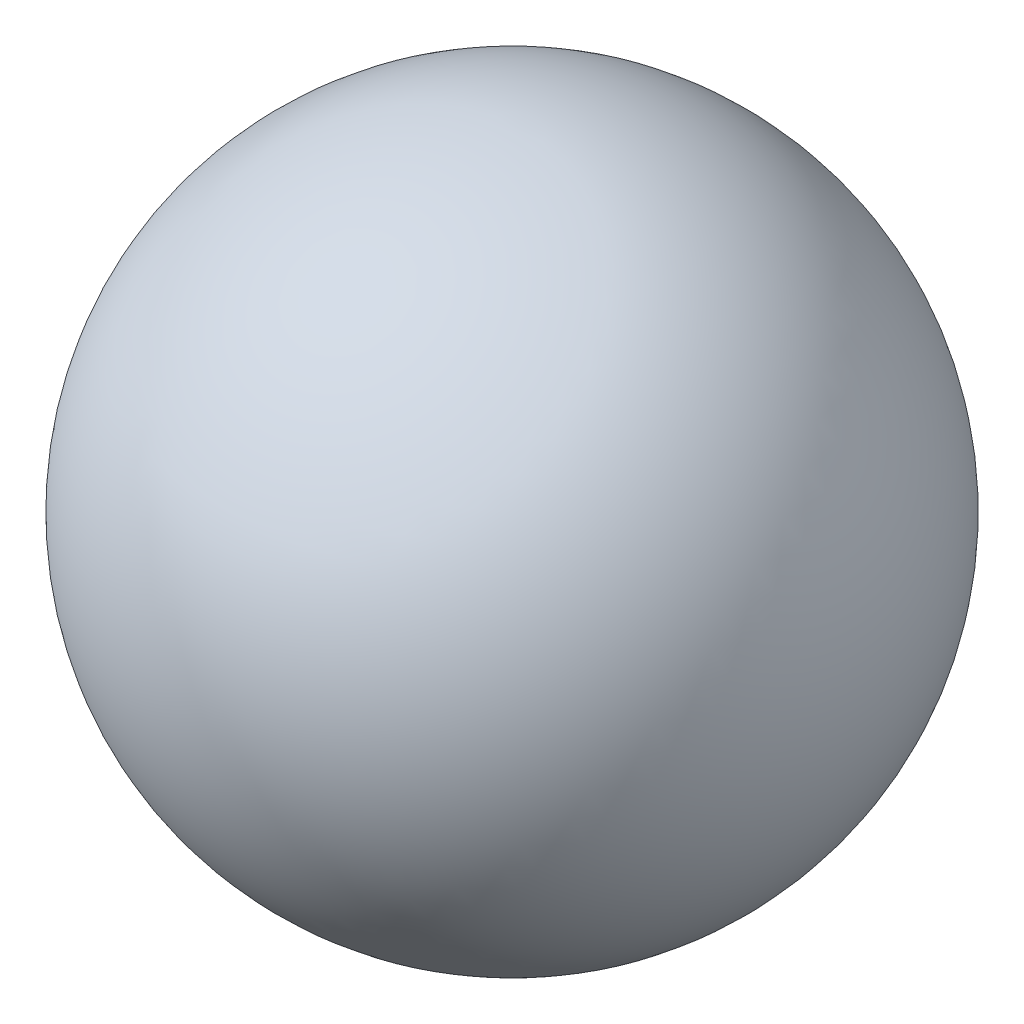
ISO-10303-21;
HEADER;
FILE_DESCRIPTION(('STEP AP214'),'2;1');
FILE_NAME('part.step','',(''),(''),'','','');
FILE_SCHEMA(('AUTOMOTIVE_DESIGN { 1 0 10303 214 1 1 1 1 }'));
ENDSEC;
DATA;
#1=APPLICATION_CONTEXT('core data for automotive mechanical design processes');
#2=APPLICATION_PROTOCOL_DEFINITION('international standard','automotive_design',2000,#1);
#3=PRODUCT_CONTEXT('',#1,'mechanical');
#4=PRODUCT('Part','Part','',(#3));
#5=PRODUCT_RELATED_PRODUCT_CATEGORY('part','',(#4));
#6=PRODUCT_DEFINITION_FORMATION('','',#4);
#7=PRODUCT_DEFINITION_CONTEXT('part definition',#1,'design');
#8=PRODUCT_DEFINITION('design','',#6,#7);
#9=PRODUCT_DEFINITION_SHAPE('','',#8);
#10=(LENGTH_UNIT() NAMED_UNIT(*) SI_UNIT(.MILLI.,.METRE.));
#11=(NAMED_UNIT(*) PLANE_ANGLE_UNIT() SI_UNIT($,.RADIAN.));
#12=(NAMED_UNIT(*) SI_UNIT($,.STERADIAN.) SOLID_ANGLE_UNIT());
#13=UNCERTAINTY_MEASURE_WITH_UNIT(LENGTH_MEASURE(1.E-05),#10,'distance_accuracy_value','');
#14=(GEOMETRIC_REPRESENTATION_CONTEXT(3) GLOBAL_UNCERTAINTY_ASSIGNED_CONTEXT((#13)) GLOBAL_UNIT_ASSIGNED_CONTEXT((#10,
#11,#12)) REPRESENTATION_CONTEXT('',''));
#15=CARTESIAN_POINT('',(0.,0.,0.));
#16=DIRECTION('',(0.,0.,1.));
#17=DIRECTION('',(1.,0.,0.));
#18=AXIS2_PLACEMENT_3D('',#15,#16,#17);
#19=CARTESIAN_POINT('',(0.,0.,0.));
#20=DIRECTION('',(0.,1.,0.));
#21=DIRECTION('',(1.,0.,0.));
#22=AXIS2_PLACEMENT_3D('',#19,#20,#21);
#23=SPHERICAL_SURFACE('',#22,4.125);
#24=CARTESIAN_POINT('',(0.,4.125,0.));
#25=VERTEX_POINT('',#24);
#26=VERTEX_LOOP('',#25);
#27=FACE_BOUND('',#26,.T.);
#28=ADVANCED_FACE('F31',(#27),#23,.T.);
#29=CLOSED_SHELL('',(#28));
#30=MANIFOLD_SOLID_BREP('B2',#29);
#31=ADVANCED_BREP_SHAPE_REPRESENTATION('',(#18,#30),#14);
#32=SHAPE_DEFINITION_REPRESENTATION(#9,#31);
ENDSEC;
END-ISO-10303-21;
